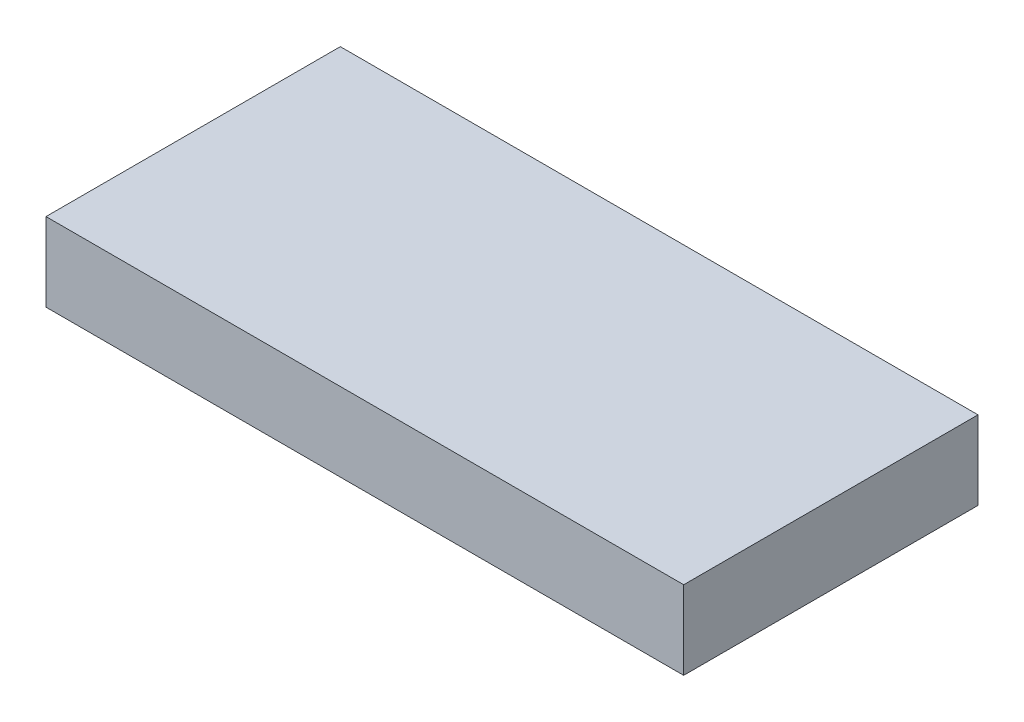
ISO-10303-21;
HEADER;
FILE_DESCRIPTION(('STEP AP214'),'2;1');
FILE_NAME('part.step','',(''),(''),'','','');
FILE_SCHEMA(('AUTOMOTIVE_DESIGN { 1 0 10303 214 1 1 1 1 }'));
ENDSEC;
DATA;
#1=APPLICATION_CONTEXT('core data for automotive mechanical design processes');
#2=APPLICATION_PROTOCOL_DEFINITION('international standard','automotive_design',2000,#1);
#3=PRODUCT_CONTEXT('',#1,'mechanical');
#4=PRODUCT('Part','Part','',(#3));
#5=PRODUCT_RELATED_PRODUCT_CATEGORY('part','',(#4));
#6=PRODUCT_DEFINITION_FORMATION('','',#4);
#7=PRODUCT_DEFINITION_CONTEXT('part definition',#1,'design');
#8=PRODUCT_DEFINITION('design','',#6,#7);
#9=PRODUCT_DEFINITION_SHAPE('','',#8);
#10=(LENGTH_UNIT() NAMED_UNIT(*) SI_UNIT(.MILLI.,.METRE.));
#11=(NAMED_UNIT(*) PLANE_ANGLE_UNIT() SI_UNIT($,.RADIAN.));
#12=(NAMED_UNIT(*) SI_UNIT($,.STERADIAN.) SOLID_ANGLE_UNIT());
#13=UNCERTAINTY_MEASURE_WITH_UNIT(LENGTH_MEASURE(1.E-05),#10,'distance_accuracy_value','');
#14=(GEOMETRIC_REPRESENTATION_CONTEXT(3) GLOBAL_UNCERTAINTY_ASSIGNED_CONTEXT((#13)) GLOBAL_UNIT_ASSIGNED_CONTEXT((#10,
#11,#12)) REPRESENTATION_CONTEXT('',''));
#15=CARTESIAN_POINT('',(0.,0.,0.));
#16=DIRECTION('',(0.,0.,1.));
#17=DIRECTION('',(1.,0.,0.));
#18=AXIS2_PLACEMENT_3D('',#15,#16,#17);
#19=CARTESIAN_POINT('',(32.5,8.,-15.));
#20=DIRECTION('',(-1.,0.,0.));
#21=DIRECTION('',(0.,0.,1.));
#22=AXIS2_PLACEMENT_3D('',#19,#20,#21);
#23=PLANE('',#22);
#24=DIRECTION('',(0.,0.,-1.));
#25=VECTOR('',#24,1.);
#26=CARTESIAN_POINT('',(32.5,0.,-15.));
#27=LINE('',#26,#25);
#28=CARTESIAN_POINT('',(32.5,0.,15.));
#29=VERTEX_POINT('',#28);
#30=CARTESIAN_POINT('',(32.5,0.,-15.));
#31=VERTEX_POINT('',#30);
#32=EDGE_CURVE('E113',#29,#31,#27,.T.);
#33=ORIENTED_EDGE('',*,*,#32,.T.);
#34=DIRECTION('',(0.,-1.,0.));
#35=VECTOR('',#34,1.);
#36=CARTESIAN_POINT('',(32.5,8.,-15.));
#37=LINE('',#36,#35);
#38=CARTESIAN_POINT('',(32.5,8.,-15.));
#39=VERTEX_POINT('',#38);
#40=EDGE_CURVE('E11',#39,#31,#37,.T.);
#41=ORIENTED_EDGE('',*,*,#40,.F.);
#42=DIRECTION('',(0.,0.,-1.));
#43=VECTOR('',#42,1.);
#44=CARTESIAN_POINT('',(32.5,8.,-15.));
#45=LINE('',#44,#43);
#46=CARTESIAN_POINT('',(32.5,8.,15.));
#47=VERTEX_POINT('',#46);
#48=EDGE_CURVE('E97',#47,#39,#45,.T.);
#49=ORIENTED_EDGE('',*,*,#48,.F.);
#50=DIRECTION('',(0.,-1.,0.));
#51=VECTOR('',#50,1.);
#52=CARTESIAN_POINT('',(32.5,8.,15.));
#53=LINE('',#52,#51);
#54=EDGE_CURVE('E109',#47,#29,#53,.T.);
#55=ORIENTED_EDGE('',*,*,#54,.T.);
#56=EDGE_LOOP('',(#33,#41,#49,#55));
#57=FACE_BOUND('',#56,.T.);
#58=ADVANCED_FACE('F45',(#57),#23,.F.);
#59=CARTESIAN_POINT('',(-32.5,8.,-15.));
#60=DIRECTION('',(0.,0.,1.));
#61=DIRECTION('',(1.,0.,0.));
#62=AXIS2_PLACEMENT_3D('',#59,#60,#61);
#63=PLANE('',#62);
#64=DIRECTION('',(-1.,0.,0.));
#65=VECTOR('',#64,1.);
#66=CARTESIAN_POINT('',(-32.5,0.,-15.));
#67=LINE('',#66,#65);
#68=CARTESIAN_POINT('',(-32.5,0.,-15.));
#69=VERTEX_POINT('',#68);
#70=EDGE_CURVE('E102',#31,#69,#67,.T.);
#71=ORIENTED_EDGE('',*,*,#70,.T.);
#72=DIRECTION('',(0.,-1.,0.));
#73=VECTOR('',#72,1.);
#74=CARTESIAN_POINT('',(-32.5,8.,-15.));
#75=LINE('',#74,#73);
#76=CARTESIAN_POINT('',(-32.5,8.,-15.));
#77=VERTEX_POINT('',#76);
#78=EDGE_CURVE('E54',#77,#69,#75,.T.);
#79=ORIENTED_EDGE('',*,*,#78,.F.);
#80=DIRECTION('',(-1.,0.,0.));
#81=VECTOR('',#80,1.);
#82=CARTESIAN_POINT('',(-32.5,8.,-15.));
#83=LINE('',#82,#81);
#84=EDGE_CURVE('E92',#39,#77,#83,.T.);
#85=ORIENTED_EDGE('',*,*,#84,.F.);
#86=ORIENTED_EDGE('',*,*,#40,.T.);
#87=EDGE_LOOP('',(#71,#79,#85,#86));
#88=FACE_BOUND('',#87,.T.);
#89=ADVANCED_FACE('F101',(#88),#63,.F.);
#90=CARTESIAN_POINT('',(-32.5,8.,-15.));
#91=DIRECTION('',(1.,0.,0.));
#92=DIRECTION('',(0.,0.,-1.));
#93=AXIS2_PLACEMENT_3D('',#90,#91,#92);
#94=PLANE('',#93);
#95=DIRECTION('',(0.,0.,1.));
#96=VECTOR('',#95,1.);
#97=CARTESIAN_POINT('',(-32.5,0.,-15.));
#98=LINE('',#97,#96);
#99=CARTESIAN_POINT('',(-32.5,0.,15.));
#100=VERTEX_POINT('',#99);
#101=EDGE_CURVE('E79',#69,#100,#98,.T.);
#102=ORIENTED_EDGE('',*,*,#101,.T.);
#103=DIRECTION('',(0.,-1.,0.));
#104=VECTOR('',#103,1.);
#105=CARTESIAN_POINT('',(-32.5,8.,15.));
#106=LINE('',#105,#104);
#107=CARTESIAN_POINT('',(-32.5,8.,15.));
#108=VERTEX_POINT('',#107);
#109=EDGE_CURVE('E104',#108,#100,#106,.T.);
#110=ORIENTED_EDGE('',*,*,#109,.F.);
#111=DIRECTION('',(0.,0.,1.));
#112=VECTOR('',#111,1.);
#113=CARTESIAN_POINT('',(-32.5,8.,-15.));
#114=LINE('',#113,#112);
#115=EDGE_CURVE('E95',#77,#108,#114,.T.);
#116=ORIENTED_EDGE('',*,*,#115,.F.);
#117=ORIENTED_EDGE('',*,*,#78,.T.);
#118=EDGE_LOOP('',(#102,#110,#116,#117));
#119=FACE_BOUND('',#118,.T.);
#120=ADVANCED_FACE('F105',(#119),#94,.F.);
#121=CARTESIAN_POINT('',(-32.5,8.,15.));
#122=DIRECTION('',(0.,0.,-1.));
#123=DIRECTION('',(-1.,0.,0.));
#124=AXIS2_PLACEMENT_3D('',#121,#122,#123);
#125=PLANE('',#124);
#126=DIRECTION('',(1.,0.,0.));
#127=VECTOR('',#126,1.);
#128=CARTESIAN_POINT('',(-32.5,0.,15.));
#129=LINE('',#128,#127);
#130=EDGE_CURVE('E85',#100,#29,#129,.T.);
#131=ORIENTED_EDGE('',*,*,#130,.T.);
#132=ORIENTED_EDGE('',*,*,#54,.F.);
#133=DIRECTION('',(1.,0.,0.));
#134=VECTOR('',#133,1.);
#135=CARTESIAN_POINT('',(-32.5,8.,15.));
#136=LINE('',#135,#134);
#137=EDGE_CURVE('E62',#108,#47,#136,.T.);
#138=ORIENTED_EDGE('',*,*,#137,.F.);
#139=ORIENTED_EDGE('',*,*,#109,.T.);
#140=EDGE_LOOP('',(#131,#132,#138,#139));
#141=FACE_BOUND('',#140,.T.);
#142=ADVANCED_FACE('F126',(#141),#125,.F.);
#143=CARTESIAN_POINT('',(0.,8.,0.));
#144=DIRECTION('',(0.,1.,0.));
#145=DIRECTION('',(0.,0.,1.));
#146=AXIS2_PLACEMENT_3D('',#143,#144,#145);
#147=PLANE('',#146);
#148=ORIENTED_EDGE('',*,*,#48,.T.);
#149=ORIENTED_EDGE('',*,*,#84,.T.);
#150=ORIENTED_EDGE('',*,*,#115,.T.);
#151=ORIENTED_EDGE('',*,*,#137,.T.);
#152=EDGE_LOOP('',(#148,#149,#150,#151));
#153=FACE_BOUND('',#152,.T.);
#154=ADVANCED_FACE('F93',(#153),#147,.T.);
#155=CARTESIAN_POINT('',(0.,0.,0.));
#156=DIRECTION('',(0.,1.,0.));
#157=DIRECTION('',(0.,0.,1.));
#158=AXIS2_PLACEMENT_3D('',#155,#156,#157);
#159=PLANE('',#158);
#160=ORIENTED_EDGE('',*,*,#32,.F.);
#161=ORIENTED_EDGE('',*,*,#130,.F.);
#162=ORIENTED_EDGE('',*,*,#101,.F.);
#163=ORIENTED_EDGE('',*,*,#70,.F.);
#164=EDGE_LOOP('',(#160,#161,#162,#163));
#165=FACE_BOUND('',#164,.T.);
#166=ADVANCED_FACE('F129',(#165),#159,.F.);
#167=CLOSED_SHELL('',(#58,#89,#120,#142,#154,#166));
#168=MANIFOLD_SOLID_BREP('B2',#167);
#169=ADVANCED_BREP_SHAPE_REPRESENTATION('',(#18,#168),#14);
#170=SHAPE_DEFINITION_REPRESENTATION(#9,#169);
ENDSEC;
END-ISO-10303-21;
